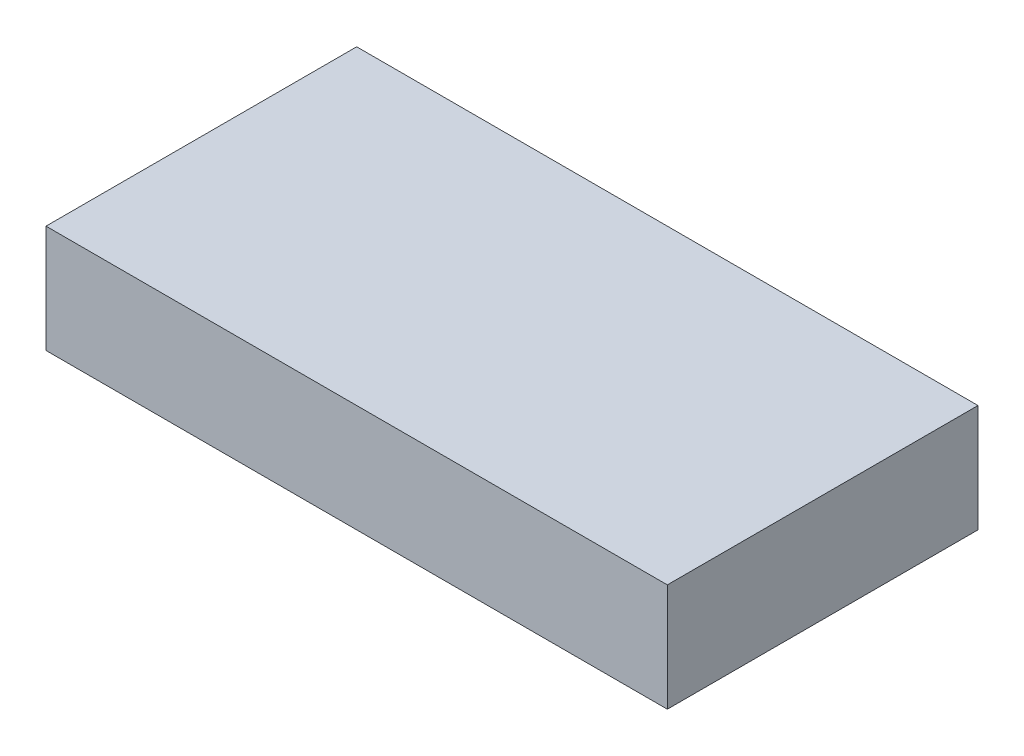
ISO-10303-21;
HEADER;
FILE_DESCRIPTION(('STEP AP214'),'2;1');
FILE_NAME('part.step','',(''),(''),'','','');
FILE_SCHEMA(('AUTOMOTIVE_DESIGN { 1 0 10303 214 1 1 1 1 }'));
ENDSEC;
DATA;
#1=APPLICATION_CONTEXT('core data for automotive mechanical design processes');
#2=APPLICATION_PROTOCOL_DEFINITION('international standard','automotive_design',2000,#1);
#3=PRODUCT_CONTEXT('',#1,'mechanical');
#4=PRODUCT('Part','Part','',(#3));
#5=PRODUCT_RELATED_PRODUCT_CATEGORY('part','',(#4));
#6=PRODUCT_DEFINITION_FORMATION('','',#4);
#7=PRODUCT_DEFINITION_CONTEXT('part definition',#1,'design');
#8=PRODUCT_DEFINITION('design','',#6,#7);
#9=PRODUCT_DEFINITION_SHAPE('','',#8);
#10=(LENGTH_UNIT() NAMED_UNIT(*) SI_UNIT(.MILLI.,.METRE.));
#11=(NAMED_UNIT(*) PLANE_ANGLE_UNIT() SI_UNIT($,.RADIAN.));
#12=(NAMED_UNIT(*) SI_UNIT($,.STERADIAN.) SOLID_ANGLE_UNIT());
#13=UNCERTAINTY_MEASURE_WITH_UNIT(LENGTH_MEASURE(1.E-05),#10,'distance_accuracy_value','');
#14=(GEOMETRIC_REPRESENTATION_CONTEXT(3) GLOBAL_UNCERTAINTY_ASSIGNED_CONTEXT((#13)) GLOBAL_UNIT_ASSIGNED_CONTEXT((#10,
#11,#12)) REPRESENTATION_CONTEXT('',''));
#15=CARTESIAN_POINT('',(0.,0.,0.));
#16=DIRECTION('',(0.,0.,1.));
#17=DIRECTION('',(1.,0.,0.));
#18=AXIS2_PLACEMENT_3D('',#15,#16,#17);
#19=CARTESIAN_POINT('',(-75.,-13.,75.));
#20=DIRECTION('',(1.,0.,0.));
#21=DIRECTION('',(0.,0.,-1.));
#22=AXIS2_PLACEMENT_3D('',#19,#20,#21);
#23=PLANE('',#22);
#24=DIRECTION('',(0.,-1.,0.));
#25=VECTOR('',#24,1.);
#26=CARTESIAN_POINT('',(-75.,-13.,0.));
#27=LINE('',#26,#25);
#28=CARTESIAN_POINT('',(-75.,13.,0.));
#29=VERTEX_POINT('',#28);
#30=CARTESIAN_POINT('',(-75.,-13.,0.));
#31=VERTEX_POINT('',#30);
#32=EDGE_CURVE('E104',#29,#31,#27,.T.);
#33=ORIENTED_EDGE('',*,*,#32,.T.);
#34=DIRECTION('',(0.,0.,-1.));
#35=VECTOR('',#34,1.);
#36=CARTESIAN_POINT('',(-75.,-13.,75.));
#37=LINE('',#36,#35);
#38=CARTESIAN_POINT('',(-75.,-13.,75.));
#39=VERTEX_POINT('',#38);
#40=EDGE_CURVE('E11',#39,#31,#37,.T.);
#41=ORIENTED_EDGE('',*,*,#40,.F.);
#42=DIRECTION('',(0.,-1.,0.));
#43=VECTOR('',#42,1.);
#44=CARTESIAN_POINT('',(-75.,-13.,75.));
#45=LINE('',#44,#43);
#46=CARTESIAN_POINT('',(-75.,13.,75.));
#47=VERTEX_POINT('',#46);
#48=EDGE_CURVE('E92',#47,#39,#45,.T.);
#49=ORIENTED_EDGE('',*,*,#48,.F.);
#50=DIRECTION('',(0.,0.,-1.));
#51=VECTOR('',#50,1.);
#52=CARTESIAN_POINT('',(-75.,13.,75.));
#53=LINE('',#52,#51);
#54=EDGE_CURVE('E100',#47,#29,#53,.T.);
#55=ORIENTED_EDGE('',*,*,#54,.T.);
#56=EDGE_LOOP('',(#33,#41,#49,#55));
#57=FACE_BOUND('',#56,.T.);
#58=ADVANCED_FACE('F41',(#57),#23,.F.);
#59=CARTESIAN_POINT('',(-75.,-13.,75.));
#60=DIRECTION('',(0.,1.,0.));
#61=DIRECTION('',(0.,0.,1.));
#62=AXIS2_PLACEMENT_3D('',#59,#60,#61);
#63=PLANE('',#62);
#64=DIRECTION('',(1.,0.,0.));
#65=VECTOR('',#64,1.);
#66=CARTESIAN_POINT('',(-75.,-13.,0.));
#67=LINE('',#66,#65);
#68=CARTESIAN_POINT('',(75.,-13.,0.));
#69=VERTEX_POINT('',#68);
#70=EDGE_CURVE('E96',#31,#69,#67,.T.);
#71=ORIENTED_EDGE('',*,*,#70,.T.);
#72=DIRECTION('',(0.,0.,-1.));
#73=VECTOR('',#72,1.);
#74=CARTESIAN_POINT('',(75.,-13.,75.));
#75=LINE('',#74,#73);
#76=CARTESIAN_POINT('',(75.,-13.,75.));
#77=VERTEX_POINT('',#76);
#78=EDGE_CURVE('E49',#77,#69,#75,.T.);
#79=ORIENTED_EDGE('',*,*,#78,.F.);
#80=DIRECTION('',(1.,0.,0.));
#81=VECTOR('',#80,1.);
#82=CARTESIAN_POINT('',(-75.,-13.,75.));
#83=LINE('',#82,#81);
#84=EDGE_CURVE('E87',#39,#77,#83,.T.);
#85=ORIENTED_EDGE('',*,*,#84,.F.);
#86=ORIENTED_EDGE('',*,*,#40,.T.);
#87=EDGE_LOOP('',(#71,#79,#85,#86));
#88=FACE_BOUND('',#87,.T.);
#89=ADVANCED_FACE('F95',(#88),#63,.F.);
#90=CARTESIAN_POINT('',(75.,-13.,75.));
#91=DIRECTION('',(-1.,0.,0.));
#92=DIRECTION('',(0.,0.,1.));
#93=AXIS2_PLACEMENT_3D('',#90,#91,#92);
#94=PLANE('',#93);
#95=DIRECTION('',(0.,1.,0.));
#96=VECTOR('',#95,1.);
#97=CARTESIAN_POINT('',(75.,-13.,0.));
#98=LINE('',#97,#96);
#99=CARTESIAN_POINT('',(75.,13.,0.));
#100=VERTEX_POINT('',#99);
#101=EDGE_CURVE('E74',#69,#100,#98,.T.);
#102=ORIENTED_EDGE('',*,*,#101,.T.);
#103=DIRECTION('',(0.,0.,-1.));
#104=VECTOR('',#103,1.);
#105=CARTESIAN_POINT('',(75.,13.,75.));
#106=LINE('',#105,#104);
#107=CARTESIAN_POINT('',(75.,13.,75.));
#108=VERTEX_POINT('',#107);
#109=EDGE_CURVE('E97',#108,#100,#106,.T.);
#110=ORIENTED_EDGE('',*,*,#109,.F.);
#111=DIRECTION('',(0.,1.,0.));
#112=VECTOR('',#111,1.);
#113=CARTESIAN_POINT('',(75.,-13.,75.));
#114=LINE('',#113,#112);
#115=EDGE_CURVE('E90',#77,#108,#114,.T.);
#116=ORIENTED_EDGE('',*,*,#115,.F.);
#117=ORIENTED_EDGE('',*,*,#78,.T.);
#118=EDGE_LOOP('',(#102,#110,#116,#117));
#119=FACE_BOUND('',#118,.T.);
#120=ADVANCED_FACE('F98',(#119),#94,.F.);
#121=CARTESIAN_POINT('',(-75.,13.,75.));
#122=DIRECTION('',(0.,-1.,0.));
#123=DIRECTION('',(0.,0.,-1.));
#124=AXIS2_PLACEMENT_3D('',#121,#122,#123);
#125=PLANE('',#124);
#126=DIRECTION('',(-1.,0.,0.));
#127=VECTOR('',#126,1.);
#128=CARTESIAN_POINT('',(-75.,13.,0.));
#129=LINE('',#128,#127);
#130=EDGE_CURVE('E80',#100,#29,#129,.T.);
#131=ORIENTED_EDGE('',*,*,#130,.T.);
#132=ORIENTED_EDGE('',*,*,#54,.F.);
#133=DIRECTION('',(-1.,0.,0.));
#134=VECTOR('',#133,1.);
#135=CARTESIAN_POINT('',(-75.,13.,75.));
#136=LINE('',#135,#134);
#137=EDGE_CURVE('E57',#108,#47,#136,.T.);
#138=ORIENTED_EDGE('',*,*,#137,.F.);
#139=ORIENTED_EDGE('',*,*,#109,.T.);
#140=EDGE_LOOP('',(#131,#132,#138,#139));
#141=FACE_BOUND('',#140,.T.);
#142=ADVANCED_FACE('F111',(#141),#125,.F.);
#143=CARTESIAN_POINT('',(0.,0.,75.));
#144=DIRECTION('',(0.,0.,-1.));
#145=DIRECTION('',(-1.,0.,0.));
#146=AXIS2_PLACEMENT_3D('',#143,#144,#145);
#147=PLANE('',#146);
#148=ORIENTED_EDGE('',*,*,#48,.T.);
#149=ORIENTED_EDGE('',*,*,#84,.T.);
#150=ORIENTED_EDGE('',*,*,#115,.T.);
#151=ORIENTED_EDGE('',*,*,#137,.T.);
#152=EDGE_LOOP('',(#148,#149,#150,#151));
#153=FACE_BOUND('',#152,.T.);
#154=ADVANCED_FACE('F88',(#153),#147,.F.);
#155=CARTESIAN_POINT('',(0.,0.,0.));
#156=DIRECTION('',(0.,0.,-1.));
#157=DIRECTION('',(-1.,0.,0.));
#158=AXIS2_PLACEMENT_3D('',#155,#156,#157);
#159=PLANE('',#158);
#160=ORIENTED_EDGE('',*,*,#32,.F.);
#161=ORIENTED_EDGE('',*,*,#130,.F.);
#162=ORIENTED_EDGE('',*,*,#101,.F.);
#163=ORIENTED_EDGE('',*,*,#70,.F.);
#164=EDGE_LOOP('',(#160,#161,#162,#163));
#165=FACE_BOUND('',#164,.T.);
#166=ADVANCED_FACE('F114',(#165),#159,.T.);
#167=CLOSED_SHELL('',(#58,#89,#120,#142,#154,#166));
#168=MANIFOLD_SOLID_BREP('B2',#167);
#169=ADVANCED_BREP_SHAPE_REPRESENTATION('',(#18,#168),#14);
#170=SHAPE_DEFINITION_REPRESENTATION(#9,#169);
ENDSEC;
END-ISO-10303-21;
